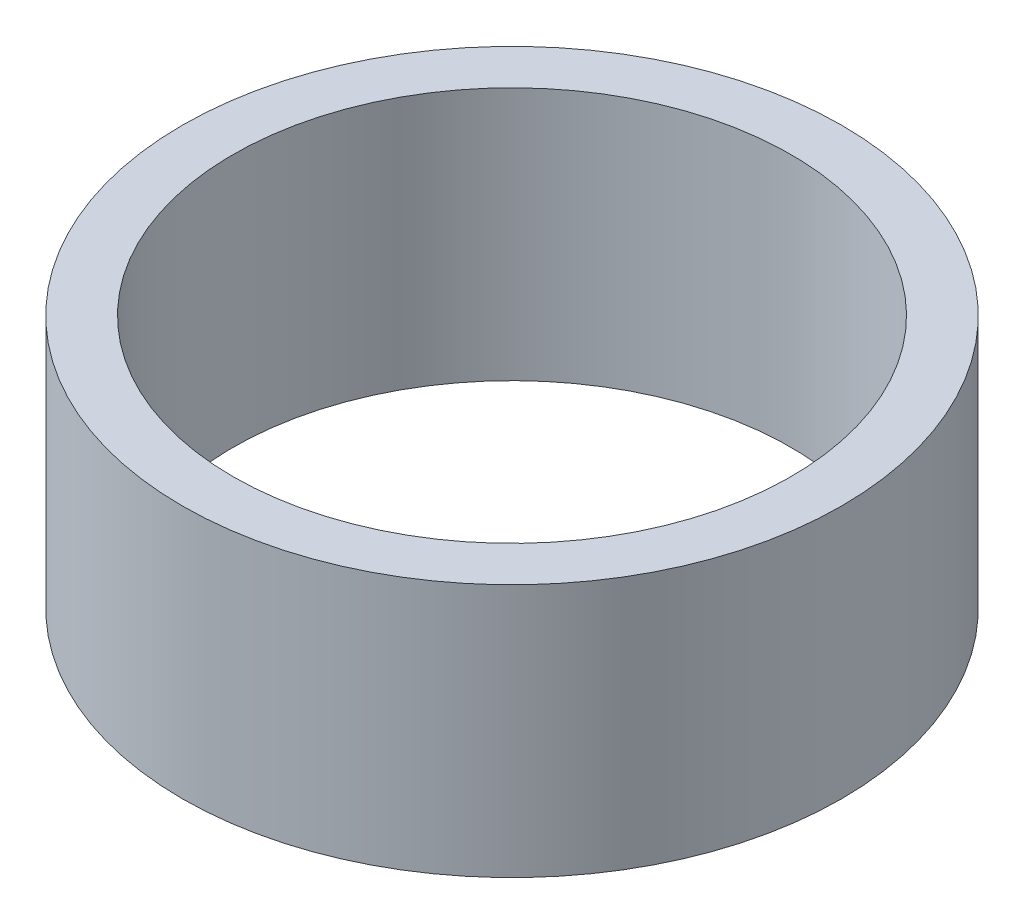
ISO-10303-21;
HEADER;
FILE_DESCRIPTION(('STEP AP214'),'2;1');
FILE_NAME('part.step','',(''),(''),'','','');
FILE_SCHEMA(('AUTOMOTIVE_DESIGN { 1 0 10303 214 1 1 1 1 }'));
ENDSEC;
DATA;
#1=APPLICATION_CONTEXT('core data for automotive mechanical design processes');
#2=APPLICATION_PROTOCOL_DEFINITION('international standard','automotive_design',2000,#1);
#3=PRODUCT_CONTEXT('',#1,'mechanical');
#4=PRODUCT('Part','Part','',(#3));
#5=PRODUCT_RELATED_PRODUCT_CATEGORY('part','',(#4));
#6=PRODUCT_DEFINITION_FORMATION('','',#4);
#7=PRODUCT_DEFINITION_CONTEXT('part definition',#1,'design');
#8=PRODUCT_DEFINITION('design','',#6,#7);
#9=PRODUCT_DEFINITION_SHAPE('','',#8);
#10=(LENGTH_UNIT() NAMED_UNIT(*) SI_UNIT(.MILLI.,.METRE.));
#11=(NAMED_UNIT(*) PLANE_ANGLE_UNIT() SI_UNIT($,.RADIAN.));
#12=(NAMED_UNIT(*) SI_UNIT($,.STERADIAN.) SOLID_ANGLE_UNIT());
#13=UNCERTAINTY_MEASURE_WITH_UNIT(LENGTH_MEASURE(1.E-05),#10,'distance_accuracy_value','');
#14=(GEOMETRIC_REPRESENTATION_CONTEXT(3) GLOBAL_UNCERTAINTY_ASSIGNED_CONTEXT((#13)) GLOBAL_UNIT_ASSIGNED_CONTEXT((#10,
#11,#12)) REPRESENTATION_CONTEXT('',''));
#15=CARTESIAN_POINT('',(0.,0.,0.));
#16=DIRECTION('',(0.,0.,1.));
#17=DIRECTION('',(1.,0.,0.));
#18=AXIS2_PLACEMENT_3D('',#15,#16,#17);
#19=CARTESIAN_POINT('',(0.,5.,0.));
#20=DIRECTION('',(0.,1.,0.));
#21=DIRECTION('',(0.,0.,1.));
#22=AXIS2_PLACEMENT_3D('',#19,#20,#21);
#23=PLANE('',#22);
#24=CARTESIAN_POINT('',(0.,5.,0.));
#25=DIRECTION('',(0.,1.,0.));
#26=DIRECTION('',(0.,0.,1.));
#27=AXIS2_PLACEMENT_3D('',#24,#25,#26);
#28=CIRCLE('',#27,6.5);
#29=CARTESIAN_POINT('',(0.,5.,6.5));
#30=VERTEX_POINT('',#29);
#31=EDGE_CURVE('E10',#30,#30,#28,.T.);
#32=ORIENTED_EDGE('',*,*,#31,.T.);
#33=EDGE_LOOP('',(#32));
#34=FACE_BOUND('',#33,.T.);
#35=CARTESIAN_POINT('',(0.,5.,0.));
#36=DIRECTION('',(0.,1.,0.));
#37=DIRECTION('',(0.,0.,1.));
#38=AXIS2_PLACEMENT_3D('',#35,#36,#37);
#39=CIRCLE('',#38,5.5);
#40=CARTESIAN_POINT('',(0.,5.,5.5));
#41=VERTEX_POINT('',#40);
#42=EDGE_CURVE('E48',#41,#41,#39,.T.);
#43=ORIENTED_EDGE('',*,*,#42,.F.);
#44=EDGE_LOOP('',(#43));
#45=FACE_BOUND('',#44,.T.);
#46=ADVANCED_FACE('F37',(#34,#45),#23,.T.);
#47=CARTESIAN_POINT('',(0.,0.,0.));
#48=DIRECTION('',(0.,1.,0.));
#49=DIRECTION('',(0.,0.,1.));
#50=AXIS2_PLACEMENT_3D('',#47,#48,#49);
#51=PLANE('',#50);
#52=CARTESIAN_POINT('',(0.,0.,0.));
#53=DIRECTION('',(0.,1.,0.));
#54=DIRECTION('',(0.,0.,1.));
#55=AXIS2_PLACEMENT_3D('',#52,#53,#54);
#56=CIRCLE('',#55,6.5);
#57=CARTESIAN_POINT('',(0.,0.,6.5));
#58=VERTEX_POINT('',#57);
#59=EDGE_CURVE('E41',#58,#58,#56,.T.);
#60=ORIENTED_EDGE('',*,*,#59,.F.);
#61=EDGE_LOOP('',(#60));
#62=FACE_BOUND('',#61,.T.);
#63=CARTESIAN_POINT('',(0.,0.,0.));
#64=DIRECTION('',(0.,1.,0.));
#65=DIRECTION('',(0.,0.,1.));
#66=AXIS2_PLACEMENT_3D('',#63,#64,#65);
#67=CIRCLE('',#66,5.5);
#68=CARTESIAN_POINT('',(0.,0.,5.5));
#69=VERTEX_POINT('',#68);
#70=EDGE_CURVE('E50',#69,#69,#67,.T.);
#71=ORIENTED_EDGE('',*,*,#70,.T.);
#72=EDGE_LOOP('',(#71));
#73=FACE_BOUND('',#72,.T.);
#74=ADVANCED_FACE('F60',(#62,#73),#51,.F.);
#75=CARTESIAN_POINT('',(0.,5.,0.));
#76=DIRECTION('',(0.,-1.,0.));
#77=DIRECTION('',(0.,0.,-1.));
#78=AXIS2_PLACEMENT_3D('',#75,#76,#77);
#79=CYLINDRICAL_SURFACE('',#78,6.5);
#80=ORIENTED_EDGE('',*,*,#31,.F.);
#81=EDGE_LOOP('',(#80));
#82=FACE_BOUND('',#81,.T.);
#83=ORIENTED_EDGE('',*,*,#59,.T.);
#84=EDGE_LOOP('',(#83));
#85=FACE_BOUND('',#84,.T.);
#86=ADVANCED_FACE('F39',(#82,#85),#79,.T.);
#87=CARTESIAN_POINT('',(0.,5.,0.));
#88=DIRECTION('',(0.,-1.,0.));
#89=DIRECTION('',(0.,0.,-1.));
#90=AXIS2_PLACEMENT_3D('',#87,#88,#89);
#91=CYLINDRICAL_SURFACE('',#90,5.5);
#92=ORIENTED_EDGE('',*,*,#42,.T.);
#93=EDGE_LOOP('',(#92));
#94=FACE_BOUND('',#93,.T.);
#95=ORIENTED_EDGE('',*,*,#70,.F.);
#96=EDGE_LOOP('',(#95));
#97=FACE_BOUND('',#96,.T.);
#98=ADVANCED_FACE('F56',(#94,#97),#91,.F.);
#99=CLOSED_SHELL('',(#46,#74,#86,#98));
#100=MANIFOLD_SOLID_BREP('B2',#99);
#101=ADVANCED_BREP_SHAPE_REPRESENTATION('',(#18,#100),#14);
#102=SHAPE_DEFINITION_REPRESENTATION(#9,#101);
ENDSEC;
END-ISO-10303-21;
